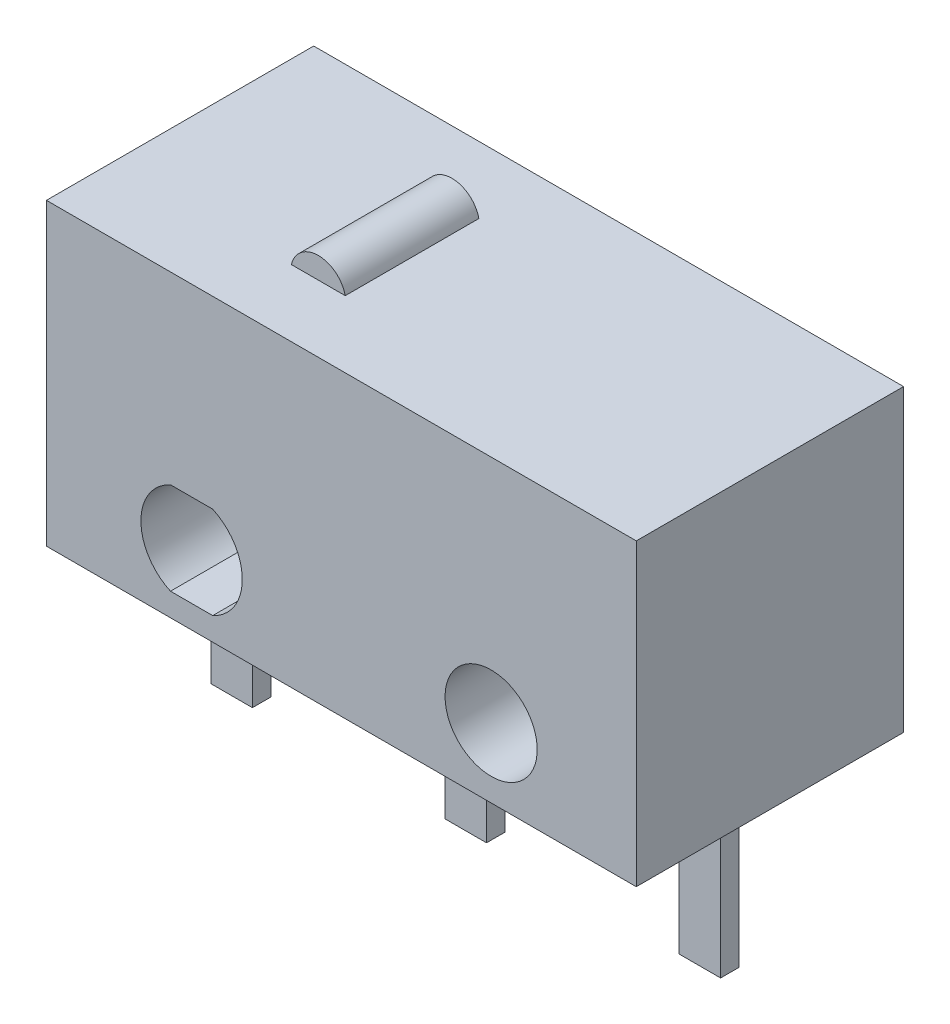
ISO-10303-21;
HEADER;
FILE_DESCRIPTION(('STEP AP214'),'2;1');
FILE_NAME('part.step','',(''),(''),'','','');
FILE_SCHEMA(('AUTOMOTIVE_DESIGN { 1 0 10303 214 1 1 1 1 }'));
ENDSEC;
DATA;
#1=APPLICATION_CONTEXT('core data for automotive mechanical design processes');
#2=APPLICATION_PROTOCOL_DEFINITION('international standard','automotive_design',2000,#1);
#3=PRODUCT_CONTEXT('',#1,'mechanical');
#4=PRODUCT('Part','Part','',(#3));
#5=PRODUCT_RELATED_PRODUCT_CATEGORY('part','',(#4));
#6=PRODUCT_DEFINITION_FORMATION('','',#4);
#7=PRODUCT_DEFINITION_CONTEXT('part definition',#1,'design');
#8=PRODUCT_DEFINITION('design','',#6,#7);
#9=PRODUCT_DEFINITION_SHAPE('','',#8);
#10=(LENGTH_UNIT() NAMED_UNIT(*) SI_UNIT(.MILLI.,.METRE.));
#11=(NAMED_UNIT(*) PLANE_ANGLE_UNIT() SI_UNIT($,.RADIAN.));
#12=(NAMED_UNIT(*) SI_UNIT($,.STERADIAN.) SOLID_ANGLE_UNIT());
#13=UNCERTAINTY_MEASURE_WITH_UNIT(LENGTH_MEASURE(1.E-05),#10,'distance_accuracy_value','');
#14=(GEOMETRIC_REPRESENTATION_CONTEXT(3) GLOBAL_UNCERTAINTY_ASSIGNED_CONTEXT((#13)) GLOBAL_UNIT_ASSIGNED_CONTEXT((#10,
#11,#12)) REPRESENTATION_CONTEXT('',''));
#15=CARTESIAN_POINT('',(0.,0.,0.));
#16=DIRECTION('',(0.,0.,1.));
#17=DIRECTION('',(1.,0.,0.));
#18=AXIS2_PLACEMENT_3D('',#15,#16,#17);
#19=CARTESIAN_POINT('',(-9.65,5.,2.9));
#20=DIRECTION('',(0.,-1.,0.));
#21=DIRECTION('',(0.,0.,-1.));
#22=AXIS2_PLACEMENT_3D('',#19,#20,#21);
#23=PLANE('',#22);
#24=DIRECTION('',(-1.,0.,0.));
#25=VECTOR('',#24,1.);
#26=CARTESIAN_POINT('',(-9.65,5.,-2.9));
#27=LINE('',#26,#25);
#28=CARTESIAN_POINT('',(3.15,5.,-2.9));
#29=VERTEX_POINT('',#28);
#30=CARTESIAN_POINT('',(-9.65,5.,-2.9));
#31=VERTEX_POINT('',#30);
#32=EDGE_CURVE('E325',#29,#31,#27,.T.);
#33=ORIENTED_EDGE('',*,*,#32,.T.);
#34=DIRECTION('',(0.,0.,-1.));
#35=VECTOR('',#34,1.);
#36=CARTESIAN_POINT('',(-9.65,5.,2.9));
#37=LINE('',#36,#35);
#38=CARTESIAN_POINT('',(-9.65,5.,2.9));
#39=VERTEX_POINT('',#38);
#40=EDGE_CURVE('E336',#39,#31,#37,.T.);
#41=ORIENTED_EDGE('',*,*,#40,.F.);
#42=DIRECTION('',(-1.,0.,0.));
#43=VECTOR('',#42,1.);
#44=CARTESIAN_POINT('',(-9.65,5.,2.9));
#45=LINE('',#44,#43);
#46=CARTESIAN_POINT('',(3.15,5.,2.9));
#47=VERTEX_POINT('',#46);
#48=EDGE_CURVE('E334',#47,#39,#45,.T.);
#49=ORIENTED_EDGE('',*,*,#48,.F.);
#50=DIRECTION('',(0.,0.,-1.));
#51=VECTOR('',#50,1.);
#52=CARTESIAN_POINT('',(3.15,5.,2.9));
#53=LINE('',#52,#51);
#54=EDGE_CURVE('E339',#47,#29,#53,.T.);
#55=ORIENTED_EDGE('',*,*,#54,.T.);
#56=EDGE_LOOP('',(#33,#41,#49,#55));
#57=FACE_BOUND('',#56,.T.);
#58=DIRECTION('',(1.,0.,0.));
#59=VECTOR('',#58,1.);
#60=CARTESIAN_POINT('',(-5.78439307447729,5.,1.45));
#61=LINE('',#60,#59);
#62=CARTESIAN_POINT('',(-5.78439307447729,5.,1.45));
#63=VERTEX_POINT('',#62);
#64=CARTESIAN_POINT('',(-4.61560692552272,5.,1.45));
#65=VERTEX_POINT('',#64);
#66=EDGE_CURVE('E179',#63,#65,#61,.T.);
#67=ORIENTED_EDGE('',*,*,#66,.F.);
#68=DIRECTION('',(0.,0.,-1.));
#69=VECTOR('',#68,1.);
#70=CARTESIAN_POINT('',(-5.78439307447729,5.,1.45));
#71=LINE('',#70,#69);
#72=CARTESIAN_POINT('',(-5.78439307447729,5.,-1.45));
#73=VERTEX_POINT('',#72);
#74=EDGE_CURVE('E175',#63,#73,#71,.T.);
#75=ORIENTED_EDGE('',*,*,#74,.T.);
#76=DIRECTION('',(1.,0.,0.));
#77=VECTOR('',#76,1.);
#78=CARTESIAN_POINT('',(-5.78439307447729,5.,-1.45));
#79=LINE('',#78,#77);
#80=CARTESIAN_POINT('',(-4.61560692552272,5.,-1.45));
#81=VERTEX_POINT('',#80);
#82=EDGE_CURVE('E164',#73,#81,#79,.T.);
#83=ORIENTED_EDGE('',*,*,#82,.T.);
#84=DIRECTION('',(0.,0.,-1.));
#85=VECTOR('',#84,1.);
#86=CARTESIAN_POINT('',(-4.61560692552272,5.,1.45));
#87=LINE('',#86,#85);
#88=EDGE_CURVE('E177',#65,#81,#87,.T.);
#89=ORIENTED_EDGE('',*,*,#88,.F.);
#90=EDGE_LOOP('',(#67,#75,#83,#89));
#91=FACE_BOUND('',#90,.T.);
#92=ADVANCED_FACE('F17',(#57,#91),#23,.F.);
#93=CARTESIAN_POINT('',(-9.65,-1.5,2.9));
#94=DIRECTION('',(0.,1.,0.));
#95=DIRECTION('',(-1.,0.,0.));
#96=AXIS2_PLACEMENT_3D('',#93,#94,#95);
#97=PLANE('',#96);
#98=DIRECTION('',(0.,0.,-1.));
#99=VECTOR('',#98,1.);
#100=CARTESIAN_POINT('',(-3.7,-1.5,0.2));
#101=LINE('',#100,#99);
#102=CARTESIAN_POINT('',(-3.7,-1.5,0.2));
#103=VERTEX_POINT('',#102);
#104=CARTESIAN_POINT('',(-3.7,-1.5,-0.2));
#105=VERTEX_POINT('',#104);
#106=EDGE_CURVE('E214',#103,#105,#101,.T.);
#107=ORIENTED_EDGE('',*,*,#106,.F.);
#108=DIRECTION('',(-1.,0.,0.));
#109=VECTOR('',#108,1.);
#110=CARTESIAN_POINT('',(-3.7,-1.5,0.2));
#111=LINE('',#110,#109);
#112=CARTESIAN_POINT('',(-2.8,-1.5,0.2));
#113=VERTEX_POINT('',#112);
#114=EDGE_CURVE('E223',#113,#103,#111,.T.);
#115=ORIENTED_EDGE('',*,*,#114,.F.);
#116=DIRECTION('',(0.,0.,1.));
#117=VECTOR('',#116,1.);
#118=CARTESIAN_POINT('',(-2.8,-1.5,0.2));
#119=LINE('',#118,#117);
#120=CARTESIAN_POINT('',(-2.8,-1.5,-0.2));
#121=VERTEX_POINT('',#120);
#122=EDGE_CURVE('E220',#121,#113,#119,.T.);
#123=ORIENTED_EDGE('',*,*,#122,.F.);
#124=DIRECTION('',(1.,0.,0.));
#125=VECTOR('',#124,1.);
#126=CARTESIAN_POINT('',(-3.7,-1.5,-0.2));
#127=LINE('',#126,#125);
#128=EDGE_CURVE('E217',#105,#121,#127,.T.);
#129=ORIENTED_EDGE('',*,*,#128,.F.);
#130=EDGE_LOOP('',(#107,#115,#123,#129));
#131=FACE_BOUND('',#130,.T.);
#132=DIRECTION('',(1.,0.,0.));
#133=VECTOR('',#132,1.);
#134=CARTESIAN_POINT('',(-9.65,-1.5,-2.9));
#135=LINE('',#134,#133);
#136=CARTESIAN_POINT('',(-9.65,-1.5,-2.9));
#137=VERTEX_POINT('',#136);
#138=CARTESIAN_POINT('',(3.15,-1.5,-2.9));
#139=VERTEX_POINT('',#138);
#140=EDGE_CURVE('E321',#137,#139,#135,.T.);
#141=ORIENTED_EDGE('',*,*,#140,.T.);
#142=DIRECTION('',(0.,0.,-1.));
#143=VECTOR('',#142,1.);
#144=CARTESIAN_POINT('',(3.15,-1.5,2.9));
#145=LINE('',#144,#143);
#146=CARTESIAN_POINT('',(3.15,-1.5,2.9));
#147=VERTEX_POINT('',#146);
#148=EDGE_CURVE('E25',#147,#139,#145,.T.);
#149=ORIENTED_EDGE('',*,*,#148,.F.);
#150=DIRECTION('',(1.,0.,0.));
#151=VECTOR('',#150,1.);
#152=CARTESIAN_POINT('',(-9.65,-1.5,2.9));
#153=LINE('',#152,#151);
#154=CARTESIAN_POINT('',(-9.65,-1.5,2.9));
#155=VERTEX_POINT('',#154);
#156=EDGE_CURVE('E330',#155,#147,#153,.T.);
#157=ORIENTED_EDGE('',*,*,#156,.F.);
#158=DIRECTION('',(0.,0.,-1.));
#159=VECTOR('',#158,1.);
#160=CARTESIAN_POINT('',(-9.65,-1.5,2.9));
#161=LINE('',#160,#159);
#162=EDGE_CURVE('E11',#155,#137,#161,.T.);
#163=ORIENTED_EDGE('',*,*,#162,.T.);
#164=EDGE_LOOP('',(#141,#149,#157,#163));
#165=FACE_BOUND('',#164,.T.);
#166=DIRECTION('',(0.,0.,1.));
#167=VECTOR('',#166,1.);
#168=CARTESIAN_POINT('',(-7.88,-1.5,0.2));
#169=LINE('',#168,#167);
#170=CARTESIAN_POINT('',(-7.88,-1.5,-0.2));
#171=VERTEX_POINT('',#170);
#172=CARTESIAN_POINT('',(-7.88,-1.5,0.2));
#173=VERTEX_POINT('',#172);
#174=EDGE_CURVE('E247',#171,#173,#169,.T.);
#175=ORIENTED_EDGE('',*,*,#174,.F.);
#176=DIRECTION('',(1.,0.,0.));
#177=VECTOR('',#176,1.);
#178=CARTESIAN_POINT('',(-7.88,-1.5,-0.2));
#179=LINE('',#178,#177);
#180=CARTESIAN_POINT('',(-8.78,-1.5,-0.2));
#181=VERTEX_POINT('',#180);
#182=EDGE_CURVE('E256',#181,#171,#179,.T.);
#183=ORIENTED_EDGE('',*,*,#182,.F.);
#184=DIRECTION('',(0.,0.,-1.));
#185=VECTOR('',#184,1.);
#186=CARTESIAN_POINT('',(-8.78,-1.5,0.2));
#187=LINE('',#186,#185);
#188=CARTESIAN_POINT('',(-8.78,-1.5,0.2));
#189=VERTEX_POINT('',#188);
#190=EDGE_CURVE('E253',#189,#181,#187,.T.);
#191=ORIENTED_EDGE('',*,*,#190,.F.);
#192=DIRECTION('',(-1.,0.,0.));
#193=VECTOR('',#192,1.);
#194=CARTESIAN_POINT('',(-7.88,-1.5,0.2));
#195=LINE('',#194,#193);
#196=EDGE_CURVE('E250',#173,#189,#195,.T.);
#197=ORIENTED_EDGE('',*,*,#196,.F.);
#198=EDGE_LOOP('',(#175,#183,#191,#197));
#199=FACE_BOUND('',#198,.T.);
#200=DIRECTION('',(0.,0.,-1.));
#201=VECTOR('',#200,1.);
#202=CARTESIAN_POINT('',(1.38,-1.5,0.2));
#203=LINE('',#202,#201);
#204=CARTESIAN_POINT('',(1.38,-1.5,0.2));
#205=VERTEX_POINT('',#204);
#206=CARTESIAN_POINT('',(1.38,-1.5,-0.2));
#207=VERTEX_POINT('',#206);
#208=EDGE_CURVE('E180',#205,#207,#203,.T.);
#209=ORIENTED_EDGE('',*,*,#208,.F.);
#210=DIRECTION('',(-1.,0.,0.));
#211=VECTOR('',#210,1.);
#212=CARTESIAN_POINT('',(1.38,-1.5,0.2));
#213=LINE('',#212,#211);
#214=CARTESIAN_POINT('',(2.28,-1.5,0.2));
#215=VERTEX_POINT('',#214);
#216=EDGE_CURVE('E191',#215,#205,#213,.T.);
#217=ORIENTED_EDGE('',*,*,#216,.F.);
#218=DIRECTION('',(0.,0.,1.));
#219=VECTOR('',#218,1.);
#220=CARTESIAN_POINT('',(2.28,-1.5,0.2));
#221=LINE('',#220,#219);
#222=CARTESIAN_POINT('',(2.28,-1.5,-0.2));
#223=VERTEX_POINT('',#222);
#224=EDGE_CURVE('E188',#223,#215,#221,.T.);
#225=ORIENTED_EDGE('',*,*,#224,.F.);
#226=DIRECTION('',(1.,0.,0.));
#227=VECTOR('',#226,1.);
#228=CARTESIAN_POINT('',(1.38,-1.5,-0.2));
#229=LINE('',#228,#227);
#230=EDGE_CURVE('E39',#207,#223,#229,.T.);
#231=ORIENTED_EDGE('',*,*,#230,.F.);
#232=EDGE_LOOP('',(#209,#217,#225,#231));
#233=FACE_BOUND('',#232,.T.);
#234=ADVANCED_FACE('F361',(#131,#165,#199,#233),#97,.F.);
#235=CARTESIAN_POINT('',(-9.65,5.,2.9));
#236=DIRECTION('',(1.,0.,0.));
#237=DIRECTION('',(0.,0.,-1.));
#238=AXIS2_PLACEMENT_3D('',#235,#236,#237);
#239=PLANE('',#238);
#240=DIRECTION('',(0.,-1.,0.));
#241=VECTOR('',#240,1.);
#242=CARTESIAN_POINT('',(-9.65,5.,-2.9));
#243=LINE('',#242,#241);
#244=EDGE_CURVE('E318',#31,#137,#243,.T.);
#245=ORIENTED_EDGE('',*,*,#244,.T.);
#246=ORIENTED_EDGE('',*,*,#162,.F.);
#247=DIRECTION('',(0.,-1.,0.));
#248=VECTOR('',#247,1.);
#249=CARTESIAN_POINT('',(-9.65,5.,2.9));
#250=LINE('',#249,#248);
#251=EDGE_CURVE('E327',#39,#155,#250,.T.);
#252=ORIENTED_EDGE('',*,*,#251,.F.);
#253=ORIENTED_EDGE('',*,*,#40,.T.);
#254=EDGE_LOOP('',(#245,#246,#252,#253));
#255=FACE_BOUND('',#254,.T.);
#256=ADVANCED_FACE('F19',(#255),#239,.F.);
#257=CARTESIAN_POINT('',(3.15,5.,2.9));
#258=DIRECTION('',(-1.,0.,0.));
#259=DIRECTION('',(0.,0.,1.));
#260=AXIS2_PLACEMENT_3D('',#257,#258,#259);
#261=PLANE('',#260);
#262=DIRECTION('',(0.,1.,0.));
#263=VECTOR('',#262,1.);
#264=CARTESIAN_POINT('',(3.15,5.,-2.9));
#265=LINE('',#264,#263);
#266=EDGE_CURVE('E323',#139,#29,#265,.T.);
#267=ORIENTED_EDGE('',*,*,#266,.T.);
#268=ORIENTED_EDGE('',*,*,#54,.F.);
#269=DIRECTION('',(0.,1.,0.));
#270=VECTOR('',#269,1.);
#271=CARTESIAN_POINT('',(3.15,5.,2.9));
#272=LINE('',#271,#270);
#273=EDGE_CURVE('E332',#147,#47,#272,.T.);
#274=ORIENTED_EDGE('',*,*,#273,.F.);
#275=ORIENTED_EDGE('',*,*,#148,.T.);
#276=EDGE_LOOP('',(#267,#268,#274,#275));
#277=FACE_BOUND('',#276,.T.);
#278=ADVANCED_FACE('F346',(#277),#261,.F.);
#279=CARTESIAN_POINT('',(-9.65,5.,2.9));
#280=DIRECTION('',(0.,0.,1.));
#281=DIRECTION('',(1.,0.,0.));
#282=AXIS2_PLACEMENT_3D('',#279,#280,#281);
#283=PLANE('',#282);
#284=CARTESIAN_POINT('',(-6.5,0.,2.9));
#285=DIRECTION('',(0.,0.,-1.));
#286=DIRECTION('',(-1.,0.,0.));
#287=AXIS2_PLACEMENT_3D('',#284,#285,#286);
#288=CIRCLE('',#287,1.1);
#289=CARTESIAN_POINT('',(-6.04174243050442,1.,2.9));
#290=VERTEX_POINT('',#289);
#291=CARTESIAN_POINT('',(-6.04174243050442,-1.,2.9));
#292=VERTEX_POINT('',#291);
#293=EDGE_CURVE('E291',#290,#292,#288,.T.);
#294=ORIENTED_EDGE('',*,*,#293,.T.);
#295=DIRECTION('',(-1.,0.,0.));
#296=VECTOR('',#295,1.);
#297=CARTESIAN_POINT('',(-6.04174243050442,-1.,2.9));
#298=LINE('',#297,#296);
#299=CARTESIAN_POINT('',(-6.95825756949558,-1.,2.9));
#300=VERTEX_POINT('',#299);
#301=EDGE_CURVE('E294',#292,#300,#298,.T.);
#302=ORIENTED_EDGE('',*,*,#301,.T.);
#303=CARTESIAN_POINT('',(-6.5,0.,2.9));
#304=DIRECTION('',(0.,0.,-1.));
#305=DIRECTION('',(-1.,0.,0.));
#306=AXIS2_PLACEMENT_3D('',#303,#304,#305);
#307=CIRCLE('',#306,1.1);
#308=CARTESIAN_POINT('',(-6.95825756949558,1.,2.9));
#309=VERTEX_POINT('',#308);
#310=EDGE_CURVE('E297',#300,#309,#307,.T.);
#311=ORIENTED_EDGE('',*,*,#310,.T.);
#312=DIRECTION('',(1.,0.,0.));
#313=VECTOR('',#312,1.);
#314=CARTESIAN_POINT('',(-6.04174243050442,1.,2.9));
#315=LINE('',#314,#313);
#316=EDGE_CURVE('E300',#309,#290,#315,.T.);
#317=ORIENTED_EDGE('',*,*,#316,.T.);
#318=EDGE_LOOP('',(#294,#302,#311,#317));
#319=FACE_BOUND('',#318,.T.);
#320=CARTESIAN_POINT('',(0.,0.,2.9));
#321=DIRECTION('',(0.,0.,-1.));
#322=DIRECTION('',(-1.,0.,0.));
#323=AXIS2_PLACEMENT_3D('',#320,#321,#322);
#324=CIRCLE('',#323,1.);
#325=CARTESIAN_POINT('',(-1.,0.,2.9));
#326=VERTEX_POINT('',#325);
#327=EDGE_CURVE('E315',#326,#326,#324,.T.);
#328=ORIENTED_EDGE('',*,*,#327,.T.);
#329=EDGE_LOOP('',(#328));
#330=FACE_BOUND('',#329,.T.);
#331=ORIENTED_EDGE('',*,*,#251,.T.);
#332=ORIENTED_EDGE('',*,*,#156,.T.);
#333=ORIENTED_EDGE('',*,*,#273,.T.);
#334=ORIENTED_EDGE('',*,*,#48,.T.);
#335=EDGE_LOOP('',(#331,#332,#333,#334));
#336=FACE_BOUND('',#335,.T.);
#337=ADVANCED_FACE('F360',(#319,#330,#336),#283,.T.);
#338=CARTESIAN_POINT('',(-9.65,5.,-2.9));
#339=DIRECTION('',(0.,0.,1.));
#340=DIRECTION('',(1.,0.,0.));
#341=AXIS2_PLACEMENT_3D('',#338,#339,#340);
#342=PLANE('',#341);
#343=DIRECTION('',(-1.,0.,0.));
#344=VECTOR('',#343,1.);
#345=CARTESIAN_POINT('',(-6.04174243050442,-1.,-2.9));
#346=LINE('',#345,#344);
#347=CARTESIAN_POINT('',(-6.04174243050442,-1.,-2.9));
#348=VERTEX_POINT('',#347);
#349=CARTESIAN_POINT('',(-6.95825756949558,-1.,-2.9));
#350=VERTEX_POINT('',#349);
#351=EDGE_CURVE('E282',#348,#350,#346,.T.);
#352=ORIENTED_EDGE('',*,*,#351,.F.);
#353=CARTESIAN_POINT('',(-6.5,0.,-2.9));
#354=DIRECTION('',(0.,0.,-1.));
#355=DIRECTION('',(-1.,0.,0.));
#356=AXIS2_PLACEMENT_3D('',#353,#354,#355);
#357=CIRCLE('',#356,1.1);
#358=CARTESIAN_POINT('',(-6.04174243050442,1.,-2.9));
#359=VERTEX_POINT('',#358);
#360=EDGE_CURVE('E280',#359,#348,#357,.T.);
#361=ORIENTED_EDGE('',*,*,#360,.F.);
#362=DIRECTION('',(1.,0.,0.));
#363=VECTOR('',#362,1.);
#364=CARTESIAN_POINT('',(-6.04174243050442,1.,-2.9));
#365=LINE('',#364,#363);
#366=CARTESIAN_POINT('',(-6.95825756949558,1.,-2.9));
#367=VERTEX_POINT('',#366);
#368=EDGE_CURVE('E288',#367,#359,#365,.T.);
#369=ORIENTED_EDGE('',*,*,#368,.F.);
#370=CARTESIAN_POINT('',(-6.5,0.,-2.9));
#371=DIRECTION('',(0.,0.,-1.));
#372=DIRECTION('',(-1.,0.,0.));
#373=AXIS2_PLACEMENT_3D('',#370,#371,#372);
#374=CIRCLE('',#373,1.1);
#375=EDGE_CURVE('E285',#350,#367,#374,.T.);
#376=ORIENTED_EDGE('',*,*,#375,.F.);
#377=EDGE_LOOP('',(#352,#361,#369,#376));
#378=FACE_BOUND('',#377,.T.);
#379=CARTESIAN_POINT('',(0.,0.,-2.9));
#380=DIRECTION('',(0.,0.,-1.));
#381=DIRECTION('',(-1.,0.,0.));
#382=AXIS2_PLACEMENT_3D('',#379,#380,#381);
#383=CIRCLE('',#382,1.);
#384=CARTESIAN_POINT('',(-1.,0.,-2.9));
#385=VERTEX_POINT('',#384);
#386=EDGE_CURVE('E306',#385,#385,#383,.T.);
#387=ORIENTED_EDGE('',*,*,#386,.F.);
#388=EDGE_LOOP('',(#387));
#389=FACE_BOUND('',#388,.T.);
#390=ORIENTED_EDGE('',*,*,#244,.F.);
#391=ORIENTED_EDGE('',*,*,#32,.F.);
#392=ORIENTED_EDGE('',*,*,#266,.F.);
#393=ORIENTED_EDGE('',*,*,#140,.F.);
#394=EDGE_LOOP('',(#390,#391,#392,#393));
#395=FACE_BOUND('',#394,.T.);
#396=ADVANCED_FACE('F352',(#378,#389,#395),#342,.F.);
#397=CARTESIAN_POINT('',(0.,0.,2.9));
#398=DIRECTION('',(0.,0.,-1.));
#399=DIRECTION('',(-1.,0.,0.));
#400=AXIS2_PLACEMENT_3D('',#397,#398,#399);
#401=CYLINDRICAL_SURFACE('',#400,1.);
#402=ORIENTED_EDGE('',*,*,#327,.F.);
#403=EDGE_LOOP('',(#402));
#404=FACE_BOUND('',#403,.T.);
#405=ORIENTED_EDGE('',*,*,#386,.T.);
#406=EDGE_LOOP('',(#405));
#407=FACE_BOUND('',#406,.T.);
#408=ADVANCED_FACE('F459',(#404,#407),#401,.F.);
#409=CARTESIAN_POINT('',(-6.5,0.,2.9));
#410=DIRECTION('',(0.,0.,-1.));
#411=DIRECTION('',(-1.,0.,0.));
#412=AXIS2_PLACEMENT_3D('',#409,#410,#411);
#413=CYLINDRICAL_SURFACE('',#412,1.1);
#414=ORIENTED_EDGE('',*,*,#360,.T.);
#415=DIRECTION('',(0.,0.,-1.));
#416=VECTOR('',#415,1.);
#417=CARTESIAN_POINT('',(-6.04174243050442,-1.,2.9));
#418=LINE('',#417,#416);
#419=EDGE_CURVE('E303',#292,#348,#418,.T.);
#420=ORIENTED_EDGE('',*,*,#419,.F.);
#421=ORIENTED_EDGE('',*,*,#293,.F.);
#422=DIRECTION('',(0.,0.,-1.));
#423=VECTOR('',#422,1.);
#424=CARTESIAN_POINT('',(-6.04174243050442,1.,2.9));
#425=LINE('',#424,#423);
#426=EDGE_CURVE('E304',#290,#359,#425,.T.);
#427=ORIENTED_EDGE('',*,*,#426,.T.);
#428=EDGE_LOOP('',(#414,#420,#421,#427));
#429=FACE_BOUND('',#428,.T.);
#430=ADVANCED_FACE('F469',(#429),#413,.F.);
#431=CARTESIAN_POINT('',(-6.04174243050442,1.,2.9));
#432=DIRECTION('',(0.,1.,0.));
#433=DIRECTION('',(0.,0.,1.));
#434=AXIS2_PLACEMENT_3D('',#431,#432,#433);
#435=PLANE('',#434);
#436=ORIENTED_EDGE('',*,*,#368,.T.);
#437=ORIENTED_EDGE('',*,*,#426,.F.);
#438=ORIENTED_EDGE('',*,*,#316,.F.);
#439=DIRECTION('',(0.,0.,-1.));
#440=VECTOR('',#439,1.);
#441=CARTESIAN_POINT('',(-6.95825756949558,1.,2.9));
#442=LINE('',#441,#440);
#443=EDGE_CURVE('E307',#309,#367,#442,.T.);
#444=ORIENTED_EDGE('',*,*,#443,.T.);
#445=EDGE_LOOP('',(#436,#437,#438,#444));
#446=FACE_BOUND('',#445,.T.);
#447=ADVANCED_FACE('F480',(#446),#435,.F.);
#448=CARTESIAN_POINT('',(-6.5,0.,2.9));
#449=DIRECTION('',(0.,0.,-1.));
#450=DIRECTION('',(-1.,0.,0.));
#451=AXIS2_PLACEMENT_3D('',#448,#449,#450);
#452=CYLINDRICAL_SURFACE('',#451,1.1);
#453=ORIENTED_EDGE('',*,*,#375,.T.);
#454=ORIENTED_EDGE('',*,*,#443,.F.);
#455=ORIENTED_EDGE('',*,*,#310,.F.);
#456=DIRECTION('',(0.,0.,-1.));
#457=VECTOR('',#456,1.);
#458=CARTESIAN_POINT('',(-6.95825756949558,-1.,2.9));
#459=LINE('',#458,#457);
#460=EDGE_CURVE('E309',#300,#350,#459,.T.);
#461=ORIENTED_EDGE('',*,*,#460,.T.);
#462=EDGE_LOOP('',(#453,#454,#455,#461));
#463=FACE_BOUND('',#462,.T.);
#464=ADVANCED_FACE('F491',(#463),#452,.F.);
#465=CARTESIAN_POINT('',(-6.04174243050442,-1.,2.9));
#466=DIRECTION('',(0.,-1.,0.));
#467=DIRECTION('',(1.,0.,0.));
#468=AXIS2_PLACEMENT_3D('',#465,#466,#467);
#469=PLANE('',#468);
#470=ORIENTED_EDGE('',*,*,#351,.T.);
#471=ORIENTED_EDGE('',*,*,#460,.F.);
#472=ORIENTED_EDGE('',*,*,#301,.F.);
#473=ORIENTED_EDGE('',*,*,#419,.T.);
#474=EDGE_LOOP('',(#470,#471,#472,#473));
#475=FACE_BOUND('',#474,.T.);
#476=ADVANCED_FACE('F502',(#475),#469,.F.);
#477=CARTESIAN_POINT('',(-7.88,-5.,0.2));
#478=DIRECTION('',(-1.,0.,0.));
#479=DIRECTION('',(0.,-1.,0.));
#480=AXIS2_PLACEMENT_3D('',#477,#478,#479);
#481=PLANE('',#480);
#482=ORIENTED_EDGE('',*,*,#174,.T.);
#483=DIRECTION('',(0.,1.,0.));
#484=VECTOR('',#483,1.);
#485=CARTESIAN_POINT('',(-7.88,-5.,0.2));
#486=LINE('',#485,#484);
#487=CARTESIAN_POINT('',(-7.88,-5.,0.2));
#488=VERTEX_POINT('',#487);
#489=EDGE_CURVE('E277',#488,#173,#486,.T.);
#490=ORIENTED_EDGE('',*,*,#489,.F.);
#491=DIRECTION('',(0.,0.,1.));
#492=VECTOR('',#491,1.);
#493=CARTESIAN_POINT('',(-7.88,-5.,0.2));
#494=LINE('',#493,#492);
#495=CARTESIAN_POINT('',(-7.88,-5.,-0.2));
#496=VERTEX_POINT('',#495);
#497=EDGE_CURVE('E259',#496,#488,#494,.T.);
#498=ORIENTED_EDGE('',*,*,#497,.F.);
#499=DIRECTION('',(0.,1.,0.));
#500=VECTOR('',#499,1.);
#501=CARTESIAN_POINT('',(-7.88,-5.,-0.2));
#502=LINE('',#501,#500);
#503=EDGE_CURVE('E268',#496,#171,#502,.T.);
#504=ORIENTED_EDGE('',*,*,#503,.T.);
#505=EDGE_LOOP('',(#482,#490,#498,#504));
#506=FACE_BOUND('',#505,.T.);
#507=ADVANCED_FACE('F513',(#506),#481,.F.);
#508=CARTESIAN_POINT('',(-7.88,-5.,0.2));
#509=DIRECTION('',(0.,0.,-1.));
#510=DIRECTION('',(-1.,0.,0.));
#511=AXIS2_PLACEMENT_3D('',#508,#509,#510);
#512=PLANE('',#511);
#513=ORIENTED_EDGE('',*,*,#196,.T.);
#514=DIRECTION('',(0.,1.,0.));
#515=VECTOR('',#514,1.);
#516=CARTESIAN_POINT('',(-8.78,-5.,0.2));
#517=LINE('',#516,#515);
#518=CARTESIAN_POINT('',(-8.78,-5.,0.2));
#519=VERTEX_POINT('',#518);
#520=EDGE_CURVE('E274',#519,#189,#517,.T.);
#521=ORIENTED_EDGE('',*,*,#520,.F.);
#522=DIRECTION('',(-1.,0.,0.));
#523=VECTOR('',#522,1.);
#524=CARTESIAN_POINT('',(-7.88,-5.,0.2));
#525=LINE('',#524,#523);
#526=EDGE_CURVE('E262',#488,#519,#525,.T.);
#527=ORIENTED_EDGE('',*,*,#526,.F.);
#528=ORIENTED_EDGE('',*,*,#489,.T.);
#529=EDGE_LOOP('',(#513,#521,#527,#528));
#530=FACE_BOUND('',#529,.T.);
#531=ADVANCED_FACE('F523',(#530),#512,.F.);
#532=CARTESIAN_POINT('',(-8.78,-5.,0.2));
#533=DIRECTION('',(1.,0.,0.));
#534=DIRECTION('',(0.,0.,-1.));
#535=AXIS2_PLACEMENT_3D('',#532,#533,#534);
#536=PLANE('',#535);
#537=ORIENTED_EDGE('',*,*,#190,.T.);
#538=DIRECTION('',(0.,1.,0.));
#539=VECTOR('',#538,1.);
#540=CARTESIAN_POINT('',(-8.78,-5.,-0.2));
#541=LINE('',#540,#539);
#542=CARTESIAN_POINT('',(-8.78,-5.,-0.2));
#543=VERTEX_POINT('',#542);
#544=EDGE_CURVE('E271',#543,#181,#541,.T.);
#545=ORIENTED_EDGE('',*,*,#544,.F.);
#546=DIRECTION('',(0.,0.,-1.));
#547=VECTOR('',#546,1.);
#548=CARTESIAN_POINT('',(-8.78,-5.,0.2));
#549=LINE('',#548,#547);
#550=EDGE_CURVE('E264',#519,#543,#549,.T.);
#551=ORIENTED_EDGE('',*,*,#550,.F.);
#552=ORIENTED_EDGE('',*,*,#520,.T.);
#553=EDGE_LOOP('',(#537,#545,#551,#552));
#554=FACE_BOUND('',#553,.T.);
#555=ADVANCED_FACE('F533',(#554),#536,.F.);
#556=CARTESIAN_POINT('',(-7.88,-5.,-0.2));
#557=DIRECTION('',(0.,0.,1.));
#558=DIRECTION('',(1.,0.,0.));
#559=AXIS2_PLACEMENT_3D('',#556,#557,#558);
#560=PLANE('',#559);
#561=ORIENTED_EDGE('',*,*,#182,.T.);
#562=ORIENTED_EDGE('',*,*,#503,.F.);
#563=DIRECTION('',(1.,0.,0.));
#564=VECTOR('',#563,1.);
#565=CARTESIAN_POINT('',(-7.88,-5.,-0.2));
#566=LINE('',#565,#564);
#567=EDGE_CURVE('E266',#543,#496,#566,.T.);
#568=ORIENTED_EDGE('',*,*,#567,.F.);
#569=ORIENTED_EDGE('',*,*,#544,.T.);
#570=EDGE_LOOP('',(#561,#562,#568,#569));
#571=FACE_BOUND('',#570,.T.);
#572=ADVANCED_FACE('F543',(#571),#560,.F.);
#573=CARTESIAN_POINT('',(-7.88,-5.,-0.2));
#574=DIRECTION('',(0.,1.,0.));
#575=DIRECTION('',(0.,0.,1.));
#576=AXIS2_PLACEMENT_3D('',#573,#574,#575);
#577=PLANE('',#576);
#578=ORIENTED_EDGE('',*,*,#497,.T.);
#579=ORIENTED_EDGE('',*,*,#526,.T.);
#580=ORIENTED_EDGE('',*,*,#550,.T.);
#581=ORIENTED_EDGE('',*,*,#567,.T.);
#582=EDGE_LOOP('',(#578,#579,#580,#581));
#583=FACE_BOUND('',#582,.T.);
#584=ADVANCED_FACE('F553',(#583),#577,.F.);
#585=CARTESIAN_POINT('',(-3.7,-5.,0.2));
#586=DIRECTION('',(1.,0.,0.));
#587=DIRECTION('',(0.,0.,-1.));
#588=AXIS2_PLACEMENT_3D('',#585,#586,#587);
#589=PLANE('',#588);
#590=ORIENTED_EDGE('',*,*,#106,.T.);
#591=DIRECTION('',(0.,1.,0.));
#592=VECTOR('',#591,1.);
#593=CARTESIAN_POINT('',(-3.7,-5.,-0.2));
#594=LINE('',#593,#592);
#595=CARTESIAN_POINT('',(-3.7,-5.,-0.2));
#596=VERTEX_POINT('',#595);
#597=EDGE_CURVE('E244',#596,#105,#594,.T.);
#598=ORIENTED_EDGE('',*,*,#597,.F.);
#599=DIRECTION('',(0.,0.,-1.));
#600=VECTOR('',#599,1.);
#601=CARTESIAN_POINT('',(-3.7,-5.,0.2));
#602=LINE('',#601,#600);
#603=CARTESIAN_POINT('',(-3.7,-5.,0.2));
#604=VERTEX_POINT('',#603);
#605=EDGE_CURVE('E226',#604,#596,#602,.T.);
#606=ORIENTED_EDGE('',*,*,#605,.F.);
#607=DIRECTION('',(0.,1.,0.));
#608=VECTOR('',#607,1.);
#609=CARTESIAN_POINT('',(-3.7,-5.,0.2));
#610=LINE('',#609,#608);
#611=EDGE_CURVE('E235',#604,#103,#610,.T.);
#612=ORIENTED_EDGE('',*,*,#611,.T.);
#613=EDGE_LOOP('',(#590,#598,#606,#612));
#614=FACE_BOUND('',#613,.T.);
#615=ADVANCED_FACE('F563',(#614),#589,.F.);
#616=CARTESIAN_POINT('',(-3.7,-5.,-0.2));
#617=DIRECTION('',(0.,0.,1.));
#618=DIRECTION('',(1.,0.,0.));
#619=AXIS2_PLACEMENT_3D('',#616,#617,#618);
#620=PLANE('',#619);
#621=ORIENTED_EDGE('',*,*,#128,.T.);
#622=DIRECTION('',(0.,1.,0.));
#623=VECTOR('',#622,1.);
#624=CARTESIAN_POINT('',(-2.8,-5.,-0.2));
#625=LINE('',#624,#623);
#626=CARTESIAN_POINT('',(-2.8,-5.,-0.2));
#627=VERTEX_POINT('',#626);
#628=EDGE_CURVE('E241',#627,#121,#625,.T.);
#629=ORIENTED_EDGE('',*,*,#628,.F.);
#630=DIRECTION('',(1.,0.,0.));
#631=VECTOR('',#630,1.);
#632=CARTESIAN_POINT('',(-3.7,-5.,-0.2));
#633=LINE('',#632,#631);
#634=EDGE_CURVE('E229',#596,#627,#633,.T.);
#635=ORIENTED_EDGE('',*,*,#634,.F.);
#636=ORIENTED_EDGE('',*,*,#597,.T.);
#637=EDGE_LOOP('',(#621,#629,#635,#636));
#638=FACE_BOUND('',#637,.T.);
#639=ADVANCED_FACE('F573',(#638),#620,.F.);
#640=CARTESIAN_POINT('',(-2.8,-5.,0.2));
#641=DIRECTION('',(-1.,0.,0.));
#642=DIRECTION('',(0.,0.,1.));
#643=AXIS2_PLACEMENT_3D('',#640,#641,#642);
#644=PLANE('',#643);
#645=ORIENTED_EDGE('',*,*,#122,.T.);
#646=DIRECTION('',(0.,1.,0.));
#647=VECTOR('',#646,1.);
#648=CARTESIAN_POINT('',(-2.8,-5.,0.2));
#649=LINE('',#648,#647);
#650=CARTESIAN_POINT('',(-2.8,-5.,0.2));
#651=VERTEX_POINT('',#650);
#652=EDGE_CURVE('E238',#651,#113,#649,.T.);
#653=ORIENTED_EDGE('',*,*,#652,.F.);
#654=DIRECTION('',(0.,0.,1.));
#655=VECTOR('',#654,1.);
#656=CARTESIAN_POINT('',(-2.8,-5.,0.2));
#657=LINE('',#656,#655);
#658=EDGE_CURVE('E231',#627,#651,#657,.T.);
#659=ORIENTED_EDGE('',*,*,#658,.F.);
#660=ORIENTED_EDGE('',*,*,#628,.T.);
#661=EDGE_LOOP('',(#645,#653,#659,#660));
#662=FACE_BOUND('',#661,.T.);
#663=ADVANCED_FACE('F583',(#662),#644,.F.);
#664=CARTESIAN_POINT('',(-3.7,-5.,0.2));
#665=DIRECTION('',(0.,0.,-1.));
#666=DIRECTION('',(-1.,0.,0.));
#667=AXIS2_PLACEMENT_3D('',#664,#665,#666);
#668=PLANE('',#667);
#669=ORIENTED_EDGE('',*,*,#114,.T.);
#670=ORIENTED_EDGE('',*,*,#611,.F.);
#671=DIRECTION('',(-1.,0.,0.));
#672=VECTOR('',#671,1.);
#673=CARTESIAN_POINT('',(-3.7,-5.,0.2));
#674=LINE('',#673,#672);
#675=EDGE_CURVE('E233',#651,#604,#674,.T.);
#676=ORIENTED_EDGE('',*,*,#675,.F.);
#677=ORIENTED_EDGE('',*,*,#652,.T.);
#678=EDGE_LOOP('',(#669,#670,#676,#677));
#679=FACE_BOUND('',#678,.T.);
#680=ADVANCED_FACE('F593',(#679),#668,.F.);
#681=CARTESIAN_POINT('',(-3.7,-5.,-0.2));
#682=DIRECTION('',(0.,-1.,0.));
#683=DIRECTION('',(0.,0.,-1.));
#684=AXIS2_PLACEMENT_3D('',#681,#682,#683);
#685=PLANE('',#684);
#686=ORIENTED_EDGE('',*,*,#605,.T.);
#687=ORIENTED_EDGE('',*,*,#634,.T.);
#688=ORIENTED_EDGE('',*,*,#658,.T.);
#689=ORIENTED_EDGE('',*,*,#675,.T.);
#690=EDGE_LOOP('',(#686,#687,#688,#689));
#691=FACE_BOUND('',#690,.T.);
#692=ADVANCED_FACE('F390',(#691),#685,.T.);
#693=CARTESIAN_POINT('',(1.38,-5.,0.2));
#694=DIRECTION('',(1.,0.,0.));
#695=DIRECTION('',(0.,1.,0.));
#696=AXIS2_PLACEMENT_3D('',#693,#694,#695);
#697=PLANE('',#696);
#698=ORIENTED_EDGE('',*,*,#208,.T.);
#699=DIRECTION('',(0.,1.,0.));
#700=VECTOR('',#699,1.);
#701=CARTESIAN_POINT('',(1.38,-5.,-0.2));
#702=LINE('',#701,#700);
#703=CARTESIAN_POINT('',(1.38,-5.,-0.2));
#704=VERTEX_POINT('',#703);
#705=EDGE_CURVE('E212',#704,#207,#702,.T.);
#706=ORIENTED_EDGE('',*,*,#705,.F.);
#707=DIRECTION('',(0.,0.,-1.));
#708=VECTOR('',#707,1.);
#709=CARTESIAN_POINT('',(1.38,-5.,0.2));
#710=LINE('',#709,#708);
#711=CARTESIAN_POINT('',(1.38,-5.,0.2));
#712=VERTEX_POINT('',#711);
#713=EDGE_CURVE('E194',#712,#704,#710,.T.);
#714=ORIENTED_EDGE('',*,*,#713,.F.);
#715=DIRECTION('',(0.,1.,0.));
#716=VECTOR('',#715,1.);
#717=CARTESIAN_POINT('',(1.38,-5.,0.2));
#718=LINE('',#717,#716);
#719=EDGE_CURVE('E203',#712,#205,#718,.T.);
#720=ORIENTED_EDGE('',*,*,#719,.T.);
#721=EDGE_LOOP('',(#698,#706,#714,#720));
#722=FACE_BOUND('',#721,.T.);
#723=ADVANCED_FACE('F373',(#722),#697,.F.);
#724=CARTESIAN_POINT('',(1.38,-5.,-0.2));
#725=DIRECTION('',(0.,0.,1.));
#726=DIRECTION('',(1.,0.,0.));
#727=AXIS2_PLACEMENT_3D('',#724,#725,#726);
#728=PLANE('',#727);
#729=ORIENTED_EDGE('',*,*,#230,.T.);
#730=DIRECTION('',(0.,1.,0.));
#731=VECTOR('',#730,1.);
#732=CARTESIAN_POINT('',(2.28,-5.,-0.2));
#733=LINE('',#732,#731);
#734=CARTESIAN_POINT('',(2.28,-5.,-0.2));
#735=VERTEX_POINT('',#734);
#736=EDGE_CURVE('E209',#735,#223,#733,.T.);
#737=ORIENTED_EDGE('',*,*,#736,.F.);
#738=DIRECTION('',(1.,0.,0.));
#739=VECTOR('',#738,1.);
#740=CARTESIAN_POINT('',(1.38,-5.,-0.2));
#741=LINE('',#740,#739);
#742=EDGE_CURVE('E197',#704,#735,#741,.T.);
#743=ORIENTED_EDGE('',*,*,#742,.F.);
#744=ORIENTED_EDGE('',*,*,#705,.T.);
#745=EDGE_LOOP('',(#729,#737,#743,#744));
#746=FACE_BOUND('',#745,.T.);
#747=ADVANCED_FACE('F381',(#746),#728,.F.);
#748=CARTESIAN_POINT('',(2.28,-5.,0.2));
#749=DIRECTION('',(-1.,0.,0.));
#750=DIRECTION('',(0.,0.,1.));
#751=AXIS2_PLACEMENT_3D('',#748,#749,#750);
#752=PLANE('',#751);
#753=ORIENTED_EDGE('',*,*,#224,.T.);
#754=DIRECTION('',(0.,1.,0.));
#755=VECTOR('',#754,1.);
#756=CARTESIAN_POINT('',(2.28,-5.,0.2));
#757=LINE('',#756,#755);
#758=CARTESIAN_POINT('',(2.28,-5.,0.2));
#759=VERTEX_POINT('',#758);
#760=EDGE_CURVE('E206',#759,#215,#757,.T.);
#761=ORIENTED_EDGE('',*,*,#760,.F.);
#762=DIRECTION('',(0.,0.,1.));
#763=VECTOR('',#762,1.);
#764=CARTESIAN_POINT('',(2.28,-5.,0.2));
#765=LINE('',#764,#763);
#766=EDGE_CURVE('E199',#735,#759,#765,.T.);
#767=ORIENTED_EDGE('',*,*,#766,.F.);
#768=ORIENTED_EDGE('',*,*,#736,.T.);
#769=EDGE_LOOP('',(#753,#761,#767,#768));
#770=FACE_BOUND('',#769,.T.);
#771=ADVANCED_FACE('F379',(#770),#752,.F.);
#772=CARTESIAN_POINT('',(1.38,-5.,0.2));
#773=DIRECTION('',(0.,0.,-1.));
#774=DIRECTION('',(-1.,0.,0.));
#775=AXIS2_PLACEMENT_3D('',#772,#773,#774);
#776=PLANE('',#775);
#777=ORIENTED_EDGE('',*,*,#216,.T.);
#778=ORIENTED_EDGE('',*,*,#719,.F.);
#779=DIRECTION('',(-1.,0.,0.));
#780=VECTOR('',#779,1.);
#781=CARTESIAN_POINT('',(1.38,-5.,0.2));
#782=LINE('',#781,#780);
#783=EDGE_CURVE('E201',#759,#712,#782,.T.);
#784=ORIENTED_EDGE('',*,*,#783,.F.);
#785=ORIENTED_EDGE('',*,*,#760,.T.);
#786=EDGE_LOOP('',(#777,#778,#784,#785));
#787=FACE_BOUND('',#786,.T.);
#788=ADVANCED_FACE('F369',(#787),#776,.F.);
#789=CARTESIAN_POINT('',(1.38,-5.,-0.2));
#790=DIRECTION('',(0.,-1.,0.));
#791=DIRECTION('',(0.,0.,-1.));
#792=AXIS2_PLACEMENT_3D('',#789,#790,#791);
#793=PLANE('',#792);
#794=ORIENTED_EDGE('',*,*,#713,.T.);
#795=ORIENTED_EDGE('',*,*,#742,.T.);
#796=ORIENTED_EDGE('',*,*,#766,.T.);
#797=ORIENTED_EDGE('',*,*,#783,.T.);
#798=EDGE_LOOP('',(#794,#795,#796,#797));
#799=FACE_BOUND('',#798,.T.);
#800=ADVANCED_FACE('F375',(#799),#793,.T.);
#801=CARTESIAN_POINT('',(-5.2,4.86404142357693,1.45));
#802=DIRECTION('',(0.,0.,-1.));
#803=DIRECTION('',(-1.,0.,0.));
#804=AXIS2_PLACEMENT_3D('',#801,#802,#803);
#805=CYLINDRICAL_SURFACE('',#804,0.6);
#806=CARTESIAN_POINT('',(-5.2,4.86404142357693,-1.45));
#807=DIRECTION('',(0.,0.,1.));
#808=DIRECTION('',(-1.,0.,0.));
#809=AXIS2_PLACEMENT_3D('',#806,#807,#808);
#810=CIRCLE('',#809,0.6);
#811=EDGE_CURVE('E31',#81,#73,#810,.T.);
#812=ORIENTED_EDGE('',*,*,#811,.T.);
#813=ORIENTED_EDGE('',*,*,#74,.F.);
#814=CARTESIAN_POINT('',(-5.2,4.86404142357693,1.45));
#815=DIRECTION('',(0.,0.,1.));
#816=DIRECTION('',(-1.,0.,0.));
#817=AXIS2_PLACEMENT_3D('',#814,#815,#816);
#818=CIRCLE('',#817,0.6);
#819=EDGE_CURVE('E169',#65,#63,#818,.T.);
#820=ORIENTED_EDGE('',*,*,#819,.F.);
#821=ORIENTED_EDGE('',*,*,#88,.T.);
#822=EDGE_LOOP('',(#812,#813,#820,#821));
#823=FACE_BOUND('',#822,.T.);
#824=ADVANCED_FACE('F173',(#823),#805,.T.);
#825=CARTESIAN_POINT('',(-5.2,4.86404142357693,1.45));
#826=DIRECTION('',(0.,0.,-1.));
#827=DIRECTION('',(-1.,0.,0.));
#828=AXIS2_PLACEMENT_3D('',#825,#826,#827);
#829=PLANE('',#828);
#830=ORIENTED_EDGE('',*,*,#819,.T.);
#831=ORIENTED_EDGE('',*,*,#66,.T.);
#832=EDGE_LOOP('',(#830,#831));
#833=FACE_BOUND('',#832,.T.);
#834=ADVANCED_FACE('F638',(#833),#829,.F.);
#835=CARTESIAN_POINT('',(-5.2,4.86404142357693,-1.45));
#836=DIRECTION('',(0.,0.,-1.));
#837=DIRECTION('',(-1.,0.,0.));
#838=AXIS2_PLACEMENT_3D('',#835,#836,#837);
#839=PLANE('',#838);
#840=ORIENTED_EDGE('',*,*,#811,.F.);
#841=ORIENTED_EDGE('',*,*,#82,.F.);
#842=EDGE_LOOP('',(#840,#841));
#843=FACE_BOUND('',#842,.T.);
#844=ADVANCED_FACE('F165',(#843),#839,.T.);
#845=CLOSED_SHELL('',(#92,#234,#256,#278,#337,#396,#408,#430,#447,#464,#476,#507,#531,#555,#572,
#584,#615,#639,#663,#680,#692,#723,#747,#771,#788,#800,#824,#834,#844));
#846=MANIFOLD_SOLID_BREP('B1',#845);
#847=ADVANCED_BREP_SHAPE_REPRESENTATION('',(#18,#846),#14);
#848=SHAPE_DEFINITION_REPRESENTATION(#9,#847);
ENDSEC;
END-ISO-10303-21;
